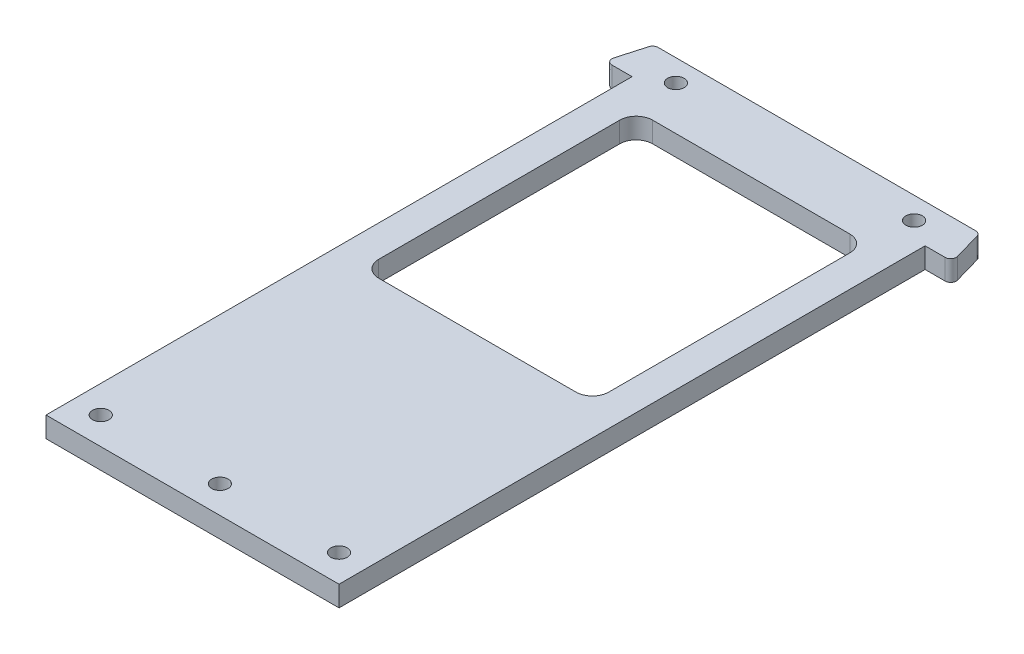
ISO-10303-21;
HEADER;
FILE_DESCRIPTION(('STEP AP214'),'2;1');
FILE_NAME('part.step','',(''),(''),'','','');
FILE_SCHEMA(('AUTOMOTIVE_DESIGN { 1 0 10303 214 1 1 1 1 }'));
ENDSEC;
DATA;
#1=APPLICATION_CONTEXT('core data for automotive mechanical design processes');
#2=APPLICATION_PROTOCOL_DEFINITION('international standard','automotive_design',2000,#1);
#3=PRODUCT_CONTEXT('',#1,'mechanical');
#4=PRODUCT('Part','Part','',(#3));
#5=PRODUCT_RELATED_PRODUCT_CATEGORY('part','',(#4));
#6=PRODUCT_DEFINITION_FORMATION('','',#4);
#7=PRODUCT_DEFINITION_CONTEXT('part definition',#1,'design');
#8=PRODUCT_DEFINITION('design','',#6,#7);
#9=PRODUCT_DEFINITION_SHAPE('','',#8);
#10=(LENGTH_UNIT() NAMED_UNIT(*) SI_UNIT(.MILLI.,.METRE.));
#11=(NAMED_UNIT(*) PLANE_ANGLE_UNIT() SI_UNIT($,.RADIAN.));
#12=(NAMED_UNIT(*) SI_UNIT($,.STERADIAN.) SOLID_ANGLE_UNIT());
#13=UNCERTAINTY_MEASURE_WITH_UNIT(LENGTH_MEASURE(1.E-05),#10,'distance_accuracy_value','');
#14=(GEOMETRIC_REPRESENTATION_CONTEXT(3) GLOBAL_UNCERTAINTY_ASSIGNED_CONTEXT((#13)) GLOBAL_UNIT_ASSIGNED_CONTEXT((#10,
#11,#12)) REPRESENTATION_CONTEXT('',''));
#15=CARTESIAN_POINT('',(0.,0.,0.));
#16=DIRECTION('',(0.,0.,1.));
#17=DIRECTION('',(1.,0.,0.));
#18=AXIS2_PLACEMENT_3D('',#15,#16,#17);
#19=CARTESIAN_POINT('',(0.,3.75,0.));
#20=DIRECTION('',(1.,0.,0.));
#21=DIRECTION('',(0.,0.,-1.));
#22=AXIS2_PLACEMENT_3D('',#19,#20,#21);
#23=PLANE('',#22);
#24=DIRECTION('',(0.,1.,0.));
#25=VECTOR('',#24,1.);
#26=CARTESIAN_POINT('',(0.,-8.60232526704263,-107.));
#27=LINE('',#26,#25);
#28=CARTESIAN_POINT('',(0.,0.,-107.));
#29=VERTEX_POINT('',#28);
#30=CARTESIAN_POINT('',(0.,3.75,-107.));
#31=VERTEX_POINT('',#30);
#32=EDGE_CURVE('E320',#29,#31,#27,.T.);
#33=ORIENTED_EDGE('',*,*,#32,.F.);
#34=DIRECTION('',(0.,0.,1.));
#35=VECTOR('',#34,1.);
#36=CARTESIAN_POINT('',(0.,0.,0.));
#37=LINE('',#36,#35);
#38=CARTESIAN_POINT('',(0.,0.,0.));
#39=VERTEX_POINT('',#38);
#40=EDGE_CURVE('E202',#29,#39,#37,.T.);
#41=ORIENTED_EDGE('',*,*,#40,.T.);
#42=DIRECTION('',(0.,-1.,0.));
#43=VECTOR('',#42,1.);
#44=CARTESIAN_POINT('',(0.,3.75,0.));
#45=LINE('',#44,#43);
#46=CARTESIAN_POINT('',(0.,3.75,0.));
#47=VERTEX_POINT('',#46);
#48=EDGE_CURVE('E216',#47,#39,#45,.T.);
#49=ORIENTED_EDGE('',*,*,#48,.F.);
#50=DIRECTION('',(0.,0.,1.));
#51=VECTOR('',#50,1.);
#52=CARTESIAN_POINT('',(0.,3.75,0.));
#53=LINE('',#52,#51);
#54=EDGE_CURVE('E200',#31,#47,#53,.T.);
#55=ORIENTED_EDGE('',*,*,#54,.F.);
#56=EDGE_LOOP('',(#33,#41,#49,#55));
#57=FACE_BOUND('',#56,.T.);
#58=ADVANCED_FACE('F32',(#57),#23,.F.);
#59=CARTESIAN_POINT('',(0.,3.75,0.));
#60=DIRECTION('',(0.,-1.,0.));
#61=DIRECTION('',(0.,0.,-1.));
#62=AXIS2_PLACEMENT_3D('',#59,#60,#61);
#63=PLANE('',#62);
#64=CARTESIAN_POINT('',(5.,3.75,-110.));
#65=DIRECTION('',(0.,1.,0.));
#66=DIRECTION('',(0.,0.,1.));
#67=AXIS2_PLACEMENT_3D('',#64,#65,#66);
#68=CIRCLE('',#67,1.5);
#69=CARTESIAN_POINT('',(5.,3.75,-108.5));
#70=VERTEX_POINT('',#69);
#71=EDGE_CURVE('E308',#70,#70,#68,.T.);
#72=ORIENTED_EDGE('',*,*,#71,.F.);
#73=EDGE_LOOP('',(#72));
#74=FACE_BOUND('',#73,.T.);
#75=CARTESIAN_POINT('',(48.5,3.75,-5.));
#76=DIRECTION('',(0.,1.,0.));
#77=DIRECTION('',(0.,0.,1.));
#78=AXIS2_PLACEMENT_3D('',#75,#76,#77);
#79=CIRCLE('',#78,1.5);
#80=CARTESIAN_POINT('',(48.5,3.75,-3.5));
#81=VERTEX_POINT('',#80);
#82=EDGE_CURVE('E296',#81,#81,#79,.T.);
#83=ORIENTED_EDGE('',*,*,#82,.F.);
#84=EDGE_LOOP('',(#83));
#85=FACE_BOUND('',#84,.T.);
#86=DIRECTION('',(0.,0.,1.));
#87=VECTOR('',#86,1.);
#88=CARTESIAN_POINT('',(5.75,3.75,-102.));
#89=LINE('',#88,#87);
#90=CARTESIAN_POINT('',(5.75,3.75,-99.));
#91=VERTEX_POINT('',#90);
#92=CARTESIAN_POINT('',(5.75000000000001,3.75,-55.));
#93=VERTEX_POINT('',#92);
#94=EDGE_CURVE('E272',#91,#93,#89,.T.);
#95=ORIENTED_EDGE('',*,*,#94,.F.);
#96=CARTESIAN_POINT('',(8.75,3.75,-99.));
#97=DIRECTION('',(0.,-1.,0.));
#98=DIRECTION('',(0.,0.,-1.));
#99=AXIS2_PLACEMENT_3D('',#96,#97,#98);
#100=CIRCLE('',#99,3.);
#101=CARTESIAN_POINT('',(8.75,3.75,-102.));
#102=VERTEX_POINT('',#101);
#103=EDGE_CURVE('E254',#91,#102,#100,.T.);
#104=ORIENTED_EDGE('',*,*,#103,.T.);
#105=DIRECTION('',(-1.,0.,0.));
#106=VECTOR('',#105,1.);
#107=CARTESIAN_POINT('',(5.75,3.75,-102.));
#108=LINE('',#107,#106);
#109=CARTESIAN_POINT('',(44.75,3.75,-102.));
#110=VERTEX_POINT('',#109);
#111=EDGE_CURVE('E258',#110,#102,#108,.T.);
#112=ORIENTED_EDGE('',*,*,#111,.F.);
#113=CARTESIAN_POINT('',(44.75,3.75,-99.));
#114=DIRECTION('',(0.,-1.,0.));
#115=DIRECTION('',(0.,0.,-1.));
#116=AXIS2_PLACEMENT_3D('',#113,#114,#115);
#117=CIRCLE('',#116,3.);
#118=CARTESIAN_POINT('',(47.75,3.75,-99.));
#119=VERTEX_POINT('',#118);
#120=EDGE_CURVE('E250',#110,#119,#117,.T.);
#121=ORIENTED_EDGE('',*,*,#120,.T.);
#122=DIRECTION('',(0.,0.,-1.));
#123=VECTOR('',#122,1.);
#124=CARTESIAN_POINT('',(47.75,3.75,-102.));
#125=LINE('',#124,#123);
#126=CARTESIAN_POINT('',(47.75,3.75,-55.));
#127=VERTEX_POINT('',#126);
#128=EDGE_CURVE('E285',#127,#119,#125,.T.);
#129=ORIENTED_EDGE('',*,*,#128,.F.);
#130=CARTESIAN_POINT('',(44.75,3.75,-55.));
#131=DIRECTION('',(0.,-1.,0.));
#132=DIRECTION('',(0.,0.,-1.));
#133=AXIS2_PLACEMENT_3D('',#130,#131,#132);
#134=CIRCLE('',#133,3.);
#135=CARTESIAN_POINT('',(44.75,3.75,-52.));
#136=VERTEX_POINT('',#135);
#137=EDGE_CURVE('E242',#127,#136,#134,.T.);
#138=ORIENTED_EDGE('',*,*,#137,.T.);
#139=DIRECTION('',(1.,0.,0.));
#140=VECTOR('',#139,1.);
#141=CARTESIAN_POINT('',(5.75000000000001,3.75,-52.));
#142=LINE('',#141,#140);
#143=CARTESIAN_POINT('',(8.75,3.75,-52.));
#144=VERTEX_POINT('',#143);
#145=EDGE_CURVE('E288',#144,#136,#142,.T.);
#146=ORIENTED_EDGE('',*,*,#145,.F.);
#147=CARTESIAN_POINT('',(8.75000000000001,3.75,-55.));
#148=DIRECTION('',(0.,-1.,0.));
#149=DIRECTION('',(0.,0.,-1.));
#150=AXIS2_PLACEMENT_3D('',#147,#148,#149);
#151=CIRCLE('',#150,3.);
#152=EDGE_CURVE('E246',#144,#93,#151,.T.);
#153=ORIENTED_EDGE('',*,*,#152,.T.);
#154=EDGE_LOOP('',(#95,#104,#112,#121,#129,#138,#146,#153));
#155=FACE_BOUND('',#154,.T.);
#156=DIRECTION('',(-0.274721127897377,0.,-0.961523947640823));
#157=VECTOR('',#156,1.);
#158=CARTESIAN_POINT('',(56.5,3.75,-114.));
#159=LINE('',#158,#157);
#160=CARTESIAN_POINT('',(58.1357939634579,3.75,-108.274721127897));
#161=VERTEX_POINT('',#160);
#162=CARTESIAN_POINT('',(56.7072225348865,3.75,-113.274721127897));
#163=VERTEX_POINT('',#162);
#164=EDGE_CURVE('E180',#161,#163,#159,.T.);
#165=ORIENTED_EDGE('',*,*,#164,.T.);
#166=CARTESIAN_POINT('',(55.7456985872456,3.75,-113.));
#167=DIRECTION('',(0.,-1.,0.));
#168=DIRECTION('',(0.,0.,-1.));
#169=AXIS2_PLACEMENT_3D('',#166,#167,#168);
#170=CIRCLE('',#169,1.);
#171=CARTESIAN_POINT('',(55.7456985872456,3.75,-114.));
#172=VERTEX_POINT('',#171);
#173=EDGE_CURVE('E342',#163,#172,#170,.F.);
#174=ORIENTED_EDGE('',*,*,#173,.T.);
#175=DIRECTION('',(-1.,0.,0.));
#176=VECTOR('',#175,1.);
#177=CARTESIAN_POINT('',(0.,3.75,-114.));
#178=LINE('',#177,#176);
#179=CARTESIAN_POINT('',(-2.24569858724564,3.75,-114.));
#180=VERTEX_POINT('',#179);
#181=EDGE_CURVE('E217',#172,#180,#178,.T.);
#182=ORIENTED_EDGE('',*,*,#181,.T.);
#183=CARTESIAN_POINT('',(-2.24569858724564,3.75,-113.));
#184=DIRECTION('',(0.,-1.,0.));
#185=DIRECTION('',(0.,0.,-1.));
#186=AXIS2_PLACEMENT_3D('',#183,#184,#185);
#187=CIRCLE('',#186,1.);
#188=CARTESIAN_POINT('',(-3.20722253488646,3.75,-113.274721127897));
#189=VERTEX_POINT('',#188);
#190=EDGE_CURVE('E336',#180,#189,#187,.F.);
#191=ORIENTED_EDGE('',*,*,#190,.T.);
#192=DIRECTION('',(-0.274721127897378,0.,0.961523947640823));
#193=VECTOR('',#192,1.);
#194=CARTESIAN_POINT('',(-3.,3.75,-114.));
#195=LINE('',#194,#193);
#196=CARTESIAN_POINT('',(-4.63579396345789,3.75,-108.274721127897));
#197=VERTEX_POINT('',#196);
#198=EDGE_CURVE('E190',#189,#197,#195,.T.);
#199=ORIENTED_EDGE('',*,*,#198,.T.);
#200=CARTESIAN_POINT('',(-3.67427001581707,3.75,-108.));
#201=DIRECTION('',(0.,-1.,0.));
#202=DIRECTION('',(0.,0.,-1.));
#203=AXIS2_PLACEMENT_3D('',#200,#201,#202);
#204=CIRCLE('',#203,1.);
#205=CARTESIAN_POINT('',(-3.67427001581707,3.75,-107.));
#206=VERTEX_POINT('',#205);
#207=EDGE_CURVE('E338',#197,#206,#204,.F.);
#208=ORIENTED_EDGE('',*,*,#207,.T.);
#209=DIRECTION('',(1.,0.,0.));
#210=VECTOR('',#209,1.);
#211=CARTESIAN_POINT('',(-5.,3.75,-107.));
#212=LINE('',#211,#210);
#213=EDGE_CURVE('E331',#206,#31,#212,.T.);
#214=ORIENTED_EDGE('',*,*,#213,.T.);
#215=ORIENTED_EDGE('',*,*,#54,.T.);
#216=DIRECTION('',(1.,0.,0.));
#217=VECTOR('',#216,1.);
#218=CARTESIAN_POINT('',(0.,3.75,0.));
#219=LINE('',#218,#217);
#220=CARTESIAN_POINT('',(53.5,3.75,0.));
#221=VERTEX_POINT('',#220);
#222=EDGE_CURVE('E266',#47,#221,#219,.T.);
#223=ORIENTED_EDGE('',*,*,#222,.T.);
#224=DIRECTION('',(0.,0.,-1.));
#225=VECTOR('',#224,1.);
#226=CARTESIAN_POINT('',(53.5,3.75,0.));
#227=LINE('',#226,#225);
#228=CARTESIAN_POINT('',(53.5,3.75,-107.));
#229=VERTEX_POINT('',#228);
#230=EDGE_CURVE('E209',#221,#229,#227,.T.);
#231=ORIENTED_EDGE('',*,*,#230,.T.);
#232=DIRECTION('',(1.,0.,0.));
#233=VECTOR('',#232,1.);
#234=CARTESIAN_POINT('',(58.5,3.75,-107.));
#235=LINE('',#234,#233);
#236=CARTESIAN_POINT('',(57.1742700158171,3.75,-107.));
#237=VERTEX_POINT('',#236);
#238=EDGE_CURVE('E186',#229,#237,#235,.T.);
#239=ORIENTED_EDGE('',*,*,#238,.T.);
#240=CARTESIAN_POINT('',(57.1742700158171,3.75,-108.));
#241=DIRECTION('',(0.,-1.,0.));
#242=DIRECTION('',(0.,0.,-1.));
#243=AXIS2_PLACEMENT_3D('',#240,#241,#242);
#244=CIRCLE('',#243,1.);
#245=EDGE_CURVE('E340',#237,#161,#244,.F.);
#246=ORIENTED_EDGE('',*,*,#245,.T.);
#247=EDGE_LOOP('',(#165,#174,#182,#191,#199,#208,#214,#215,#223,#231,#239,#246));
#248=FACE_BOUND('',#247,.T.);
#249=CARTESIAN_POINT('',(5.,3.75,-5.));
#250=DIRECTION('',(0.,1.,0.));
#251=DIRECTION('',(0.,0.,1.));
#252=AXIS2_PLACEMENT_3D('',#249,#250,#251);
#253=CIRCLE('',#252,1.5);
#254=CARTESIAN_POINT('',(5.,3.75,-3.5));
#255=VERTEX_POINT('',#254);
#256=EDGE_CURVE('E282',#255,#255,#253,.T.);
#257=ORIENTED_EDGE('',*,*,#256,.F.);
#258=EDGE_LOOP('',(#257));
#259=FACE_BOUND('',#258,.T.);
#260=CARTESIAN_POINT('',(26.75,3.75,-5.));
#261=DIRECTION('',(0.,1.,0.));
#262=DIRECTION('',(0.,0.,1.));
#263=AXIS2_PLACEMENT_3D('',#260,#261,#262);
#264=CIRCLE('',#263,1.5);
#265=CARTESIAN_POINT('',(26.75,3.75,-3.5));
#266=VERTEX_POINT('',#265);
#267=EDGE_CURVE('E302',#266,#266,#264,.T.);
#268=ORIENTED_EDGE('',*,*,#267,.F.);
#269=EDGE_LOOP('',(#268));
#270=FACE_BOUND('',#269,.T.);
#271=CARTESIAN_POINT('',(48.5,3.75,-110.));
#272=DIRECTION('',(0.,1.,0.));
#273=DIRECTION('',(0.,0.,1.));
#274=AXIS2_PLACEMENT_3D('',#271,#272,#273);
#275=CIRCLE('',#274,1.5);
#276=CARTESIAN_POINT('',(48.5,3.75,-108.5));
#277=VERTEX_POINT('',#276);
#278=EDGE_CURVE('E314',#277,#277,#275,.T.);
#279=ORIENTED_EDGE('',*,*,#278,.F.);
#280=EDGE_LOOP('',(#279));
#281=FACE_BOUND('',#280,.T.);
#282=ADVANCED_FACE('F369',(#74,#85,#155,#248,#259,#270,#281),#63,.F.);
#283=CARTESIAN_POINT('',(0.,0.,0.));
#284=DIRECTION('',(0.,-1.,0.));
#285=DIRECTION('',(0.,0.,-1.));
#286=AXIS2_PLACEMENT_3D('',#283,#284,#285);
#287=PLANE('',#286);
#288=CARTESIAN_POINT('',(5.,0.,-110.));
#289=DIRECTION('',(0.,1.,0.));
#290=DIRECTION('',(0.,0.,1.));
#291=AXIS2_PLACEMENT_3D('',#288,#289,#290);
#292=CIRCLE('',#291,1.5);
#293=CARTESIAN_POINT('',(5.,0.,-108.5));
#294=VERTEX_POINT('',#293);
#295=EDGE_CURVE('E311',#294,#294,#292,.T.);
#296=ORIENTED_EDGE('',*,*,#295,.T.);
#297=EDGE_LOOP('',(#296));
#298=FACE_BOUND('',#297,.T.);
#299=CARTESIAN_POINT('',(48.5,0.,-5.));
#300=DIRECTION('',(0.,1.,0.));
#301=DIRECTION('',(0.,0.,1.));
#302=AXIS2_PLACEMENT_3D('',#299,#300,#301);
#303=CIRCLE('',#302,1.5);
#304=CARTESIAN_POINT('',(48.5,0.,-3.5));
#305=VERTEX_POINT('',#304);
#306=EDGE_CURVE('E299',#305,#305,#303,.T.);
#307=ORIENTED_EDGE('',*,*,#306,.T.);
#308=EDGE_LOOP('',(#307));
#309=FACE_BOUND('',#308,.T.);
#310=DIRECTION('',(0.,0.,-1.));
#311=VECTOR('',#310,1.);
#312=CARTESIAN_POINT('',(47.75,0.,-102.));
#313=LINE('',#312,#311);
#314=CARTESIAN_POINT('',(47.75,0.,-55.));
#315=VERTEX_POINT('',#314);
#316=CARTESIAN_POINT('',(47.75,0.,-99.));
#317=VERTEX_POINT('',#316);
#318=EDGE_CURVE('E273',#315,#317,#313,.T.);
#319=ORIENTED_EDGE('',*,*,#318,.T.);
#320=CARTESIAN_POINT('',(44.75,0.,-99.));
#321=DIRECTION('',(0.,-1.,0.));
#322=DIRECTION('',(0.,0.,-1.));
#323=AXIS2_PLACEMENT_3D('',#320,#321,#322);
#324=CIRCLE('',#323,3.);
#325=CARTESIAN_POINT('',(44.75,0.,-102.));
#326=VERTEX_POINT('',#325);
#327=EDGE_CURVE('E248',#317,#326,#324,.F.);
#328=ORIENTED_EDGE('',*,*,#327,.T.);
#329=DIRECTION('',(-1.,0.,0.));
#330=VECTOR('',#329,1.);
#331=CARTESIAN_POINT('',(5.75,0.,-102.));
#332=LINE('',#331,#330);
#333=CARTESIAN_POINT('',(8.75,0.,-102.));
#334=VERTEX_POINT('',#333);
#335=EDGE_CURVE('E269',#326,#334,#332,.T.);
#336=ORIENTED_EDGE('',*,*,#335,.T.);
#337=CARTESIAN_POINT('',(8.75,0.,-99.));
#338=DIRECTION('',(0.,-1.,0.));
#339=DIRECTION('',(0.,0.,-1.));
#340=AXIS2_PLACEMENT_3D('',#337,#338,#339);
#341=CIRCLE('',#340,3.);
#342=CARTESIAN_POINT('',(5.75,0.,-99.));
#343=VERTEX_POINT('',#342);
#344=EDGE_CURVE('E252',#334,#343,#341,.F.);
#345=ORIENTED_EDGE('',*,*,#344,.T.);
#346=DIRECTION('',(0.,0.,1.));
#347=VECTOR('',#346,1.);
#348=CARTESIAN_POINT('',(5.75,0.,-102.));
#349=LINE('',#348,#347);
#350=CARTESIAN_POINT('',(5.75000000000001,0.,-55.));
#351=VERTEX_POINT('',#350);
#352=EDGE_CURVE('E279',#343,#351,#349,.T.);
#353=ORIENTED_EDGE('',*,*,#352,.T.);
#354=CARTESIAN_POINT('',(8.75000000000001,0.,-55.));
#355=DIRECTION('',(0.,-1.,0.));
#356=DIRECTION('',(0.,0.,-1.));
#357=AXIS2_PLACEMENT_3D('',#354,#355,#356);
#358=CIRCLE('',#357,3.);
#359=CARTESIAN_POINT('',(8.75,0.,-52.));
#360=VERTEX_POINT('',#359);
#361=EDGE_CURVE('E244',#351,#360,#358,.F.);
#362=ORIENTED_EDGE('',*,*,#361,.T.);
#363=DIRECTION('',(1.,0.,0.));
#364=VECTOR('',#363,1.);
#365=CARTESIAN_POINT('',(5.75000000000001,0.,-52.));
#366=LINE('',#365,#364);
#367=CARTESIAN_POINT('',(44.75,0.,-52.));
#368=VERTEX_POINT('',#367);
#369=EDGE_CURVE('E276',#360,#368,#366,.T.);
#370=ORIENTED_EDGE('',*,*,#369,.T.);
#371=CARTESIAN_POINT('',(44.75,0.,-55.));
#372=DIRECTION('',(0.,-1.,0.));
#373=DIRECTION('',(0.,0.,-1.));
#374=AXIS2_PLACEMENT_3D('',#371,#372,#373);
#375=CIRCLE('',#374,3.);
#376=EDGE_CURVE('E240',#368,#315,#375,.F.);
#377=ORIENTED_EDGE('',*,*,#376,.T.);
#378=EDGE_LOOP('',(#319,#328,#336,#345,#353,#362,#370,#377));
#379=FACE_BOUND('',#378,.T.);
#380=DIRECTION('',(-1.,0.,0.));
#381=VECTOR('',#380,1.);
#382=CARTESIAN_POINT('',(0.,0.,-114.));
#383=LINE('',#382,#381);
#384=CARTESIAN_POINT('',(55.7456985872456,0.,-114.));
#385=VERTEX_POINT('',#384);
#386=CARTESIAN_POINT('',(-2.24569858724564,0.,-114.));
#387=VERTEX_POINT('',#386);
#388=EDGE_CURVE('E196',#385,#387,#383,.T.);
#389=ORIENTED_EDGE('',*,*,#388,.F.);
#390=CARTESIAN_POINT('',(55.7456985872456,0.,-113.));
#391=DIRECTION('',(0.,-1.,0.));
#392=DIRECTION('',(0.,0.,-1.));
#393=AXIS2_PLACEMENT_3D('',#390,#391,#392);
#394=CIRCLE('',#393,1.);
#395=CARTESIAN_POINT('',(56.7072225348865,0.,-113.274721127897));
#396=VERTEX_POINT('',#395);
#397=EDGE_CURVE('E354',#385,#396,#394,.T.);
#398=ORIENTED_EDGE('',*,*,#397,.T.);
#399=DIRECTION('',(-0.274721127897377,0.,-0.961523947640823));
#400=VECTOR('',#399,1.);
#401=CARTESIAN_POINT('',(56.5,0.,-114.));
#402=LINE('',#401,#400);
#403=CARTESIAN_POINT('',(58.1357939634579,0.,-108.274721127897));
#404=VERTEX_POINT('',#403);
#405=EDGE_CURVE('E179',#404,#396,#402,.T.);
#406=ORIENTED_EDGE('',*,*,#405,.F.);
#407=CARTESIAN_POINT('',(57.1742700158171,0.,-108.));
#408=DIRECTION('',(0.,-1.,0.));
#409=DIRECTION('',(0.,0.,-1.));
#410=AXIS2_PLACEMENT_3D('',#407,#408,#409);
#411=CIRCLE('',#410,1.);
#412=CARTESIAN_POINT('',(57.1742700158171,0.,-107.));
#413=VERTEX_POINT('',#412);
#414=EDGE_CURVE('E47',#404,#413,#411,.T.);
#415=ORIENTED_EDGE('',*,*,#414,.T.);
#416=DIRECTION('',(1.,0.,0.));
#417=VECTOR('',#416,1.);
#418=CARTESIAN_POINT('',(58.5,0.,-107.));
#419=LINE('',#418,#417);
#420=CARTESIAN_POINT('',(53.5,0.,-107.));
#421=VERTEX_POINT('',#420);
#422=EDGE_CURVE('E168',#421,#413,#419,.T.);
#423=ORIENTED_EDGE('',*,*,#422,.F.);
#424=DIRECTION('',(0.,0.,-1.));
#425=VECTOR('',#424,1.);
#426=CARTESIAN_POINT('',(53.5,0.,0.));
#427=LINE('',#426,#425);
#428=CARTESIAN_POINT('',(53.5,0.,0.));
#429=VERTEX_POINT('',#428);
#430=EDGE_CURVE('E175',#429,#421,#427,.T.);
#431=ORIENTED_EDGE('',*,*,#430,.F.);
#432=DIRECTION('',(1.,0.,0.));
#433=VECTOR('',#432,1.);
#434=CARTESIAN_POINT('',(0.,0.,0.));
#435=LINE('',#434,#433);
#436=EDGE_CURVE('E197',#39,#429,#435,.T.);
#437=ORIENTED_EDGE('',*,*,#436,.F.);
#438=ORIENTED_EDGE('',*,*,#40,.F.);
#439=DIRECTION('',(1.,0.,0.));
#440=VECTOR('',#439,1.);
#441=CARTESIAN_POINT('',(-5.,0.,-107.));
#442=LINE('',#441,#440);
#443=CARTESIAN_POINT('',(-3.67427001581707,0.,-107.));
#444=VERTEX_POINT('',#443);
#445=EDGE_CURVE('E328',#444,#29,#442,.T.);
#446=ORIENTED_EDGE('',*,*,#445,.F.);
#447=CARTESIAN_POINT('',(-3.67427001581707,0.,-108.));
#448=DIRECTION('',(0.,-1.,0.));
#449=DIRECTION('',(0.,0.,-1.));
#450=AXIS2_PLACEMENT_3D('',#447,#448,#449);
#451=CIRCLE('',#450,1.);
#452=CARTESIAN_POINT('',(-4.63579396345789,0.,-108.274721127897));
#453=VERTEX_POINT('',#452);
#454=EDGE_CURVE('E54',#444,#453,#451,.T.);
#455=ORIENTED_EDGE('',*,*,#454,.T.);
#456=DIRECTION('',(-0.274721127897378,0.,0.961523947640823));
#457=VECTOR('',#456,1.);
#458=CARTESIAN_POINT('',(-3.,0.,-114.));
#459=LINE('',#458,#457);
#460=CARTESIAN_POINT('',(-3.20722253488646,0.,-113.274721127897));
#461=VERTEX_POINT('',#460);
#462=EDGE_CURVE('E325',#461,#453,#459,.T.);
#463=ORIENTED_EDGE('',*,*,#462,.F.);
#464=CARTESIAN_POINT('',(-2.24569858724564,0.,-113.));
#465=DIRECTION('',(0.,-1.,0.));
#466=DIRECTION('',(0.,0.,-1.));
#467=AXIS2_PLACEMENT_3D('',#464,#465,#466);
#468=CIRCLE('',#467,1.);
#469=EDGE_CURVE('E349',#461,#387,#468,.T.);
#470=ORIENTED_EDGE('',*,*,#469,.T.);
#471=EDGE_LOOP('',(#389,#398,#406,#415,#423,#431,#437,#438,#446,#455,#463,#470));
#472=FACE_BOUND('',#471,.T.);
#473=CARTESIAN_POINT('',(5.,0.,-5.));
#474=DIRECTION('',(0.,1.,0.));
#475=DIRECTION('',(0.,0.,1.));
#476=AXIS2_PLACEMENT_3D('',#473,#474,#475);
#477=CIRCLE('',#476,1.5);
#478=CARTESIAN_POINT('',(5.,0.,-3.5));
#479=VERTEX_POINT('',#478);
#480=EDGE_CURVE('E293',#479,#479,#477,.T.);
#481=ORIENTED_EDGE('',*,*,#480,.T.);
#482=EDGE_LOOP('',(#481));
#483=FACE_BOUND('',#482,.T.);
#484=CARTESIAN_POINT('',(26.75,0.,-5.));
#485=DIRECTION('',(0.,1.,0.));
#486=DIRECTION('',(0.,0.,1.));
#487=AXIS2_PLACEMENT_3D('',#484,#485,#486);
#488=CIRCLE('',#487,1.5);
#489=CARTESIAN_POINT('',(26.75,0.,-3.5));
#490=VERTEX_POINT('',#489);
#491=EDGE_CURVE('E305',#490,#490,#488,.T.);
#492=ORIENTED_EDGE('',*,*,#491,.T.);
#493=EDGE_LOOP('',(#492));
#494=FACE_BOUND('',#493,.T.);
#495=CARTESIAN_POINT('',(48.5,0.,-110.));
#496=DIRECTION('',(0.,1.,0.));
#497=DIRECTION('',(0.,0.,1.));
#498=AXIS2_PLACEMENT_3D('',#495,#496,#497);
#499=CIRCLE('',#498,1.5);
#500=CARTESIAN_POINT('',(48.5,0.,-108.5));
#501=VERTEX_POINT('',#500);
#502=EDGE_CURVE('E317',#501,#501,#499,.T.);
#503=ORIENTED_EDGE('',*,*,#502,.T.);
#504=EDGE_LOOP('',(#503));
#505=FACE_BOUND('',#504,.T.);
#506=ADVANCED_FACE('F171',(#298,#309,#379,#472,#483,#494,#505),#287,.T.);
#507=CARTESIAN_POINT('',(0.,3.75,0.));
#508=DIRECTION('',(0.,0.,-1.));
#509=DIRECTION('',(-1.,0.,0.));
#510=AXIS2_PLACEMENT_3D('',#507,#508,#509);
#511=PLANE('',#510);
#512=ORIENTED_EDGE('',*,*,#436,.T.);
#513=DIRECTION('',(0.,-1.,0.));
#514=VECTOR('',#513,1.);
#515=CARTESIAN_POINT('',(53.5,3.75,0.));
#516=LINE('',#515,#514);
#517=EDGE_CURVE('E195',#221,#429,#516,.T.);
#518=ORIENTED_EDGE('',*,*,#517,.F.);
#519=ORIENTED_EDGE('',*,*,#222,.F.);
#520=ORIENTED_EDGE('',*,*,#48,.T.);
#521=EDGE_LOOP('',(#512,#518,#519,#520));
#522=FACE_BOUND('',#521,.T.);
#523=ADVANCED_FACE('F394',(#522),#511,.F.);
#524=CARTESIAN_POINT('',(53.5,3.75,0.));
#525=DIRECTION('',(-1.,0.,0.));
#526=DIRECTION('',(0.,0.,1.));
#527=AXIS2_PLACEMENT_3D('',#524,#525,#526);
#528=PLANE('',#527);
#529=ORIENTED_EDGE('',*,*,#430,.T.);
#530=DIRECTION('',(0.,1.,0.));
#531=VECTOR('',#530,1.);
#532=CARTESIAN_POINT('',(53.5,-8.60232526704263,-107.));
#533=LINE('',#532,#531);
#534=EDGE_CURVE('E183',#421,#229,#533,.T.);
#535=ORIENTED_EDGE('',*,*,#534,.T.);
#536=ORIENTED_EDGE('',*,*,#230,.F.);
#537=ORIENTED_EDGE('',*,*,#517,.T.);
#538=EDGE_LOOP('',(#529,#535,#536,#537));
#539=FACE_BOUND('',#538,.T.);
#540=ADVANCED_FACE('F193',(#539),#528,.F.);
#541=CARTESIAN_POINT('',(0.,3.75,-114.));
#542=DIRECTION('',(0.,0.,1.));
#543=DIRECTION('',(1.,0.,0.));
#544=AXIS2_PLACEMENT_3D('',#541,#542,#543);
#545=PLANE('',#544);
#546=ORIENTED_EDGE('',*,*,#181,.F.);
#547=DIRECTION('',(0.,1.,0.));
#548=VECTOR('',#547,1.);
#549=CARTESIAN_POINT('',(55.7456985872456,0.,-114.));
#550=LINE('',#549,#548);
#551=EDGE_CURVE('E347',#172,#385,#550,.F.);
#552=ORIENTED_EDGE('',*,*,#551,.T.);
#553=ORIENTED_EDGE('',*,*,#388,.T.);
#554=DIRECTION('',(0.,1.,0.));
#555=VECTOR('',#554,1.);
#556=CARTESIAN_POINT('',(-2.24569858724564,3.75,-114.));
#557=LINE('',#556,#555);
#558=EDGE_CURVE('E344',#387,#180,#557,.T.);
#559=ORIENTED_EDGE('',*,*,#558,.T.);
#560=EDGE_LOOP('',(#546,#552,#553,#559));
#561=FACE_BOUND('',#560,.T.);
#562=ADVANCED_FACE('F448',(#561),#545,.F.);
#563=CARTESIAN_POINT('',(5.75,3.75,-102.));
#564=DIRECTION('',(1.,0.,0.));
#565=DIRECTION('',(0.,0.,-1.));
#566=AXIS2_PLACEMENT_3D('',#563,#564,#565);
#567=PLANE('',#566);
#568=ORIENTED_EDGE('',*,*,#94,.T.);
#569=DIRECTION('',(0.,-1.,0.));
#570=VECTOR('',#569,1.);
#571=CARTESIAN_POINT('',(5.75000000000001,0.,-55.));
#572=LINE('',#571,#570);
#573=EDGE_CURVE('E232',#93,#351,#572,.T.);
#574=ORIENTED_EDGE('',*,*,#573,.T.);
#575=ORIENTED_EDGE('',*,*,#352,.F.);
#576=DIRECTION('',(0.,-1.,0.));
#577=VECTOR('',#576,1.);
#578=CARTESIAN_POINT('',(5.75,3.75,-99.));
#579=LINE('',#578,#577);
#580=EDGE_CURVE('E230',#343,#91,#579,.F.);
#581=ORIENTED_EDGE('',*,*,#580,.T.);
#582=EDGE_LOOP('',(#568,#574,#575,#581));
#583=FACE_BOUND('',#582,.T.);
#584=ADVANCED_FACE('F450',(#583),#567,.T.);
#585=CARTESIAN_POINT('',(5.75000000000001,3.75,-52.));
#586=DIRECTION('',(0.,0.,-1.));
#587=DIRECTION('',(-1.,0.,0.));
#588=AXIS2_PLACEMENT_3D('',#585,#586,#587);
#589=PLANE('',#588);
#590=ORIENTED_EDGE('',*,*,#145,.T.);
#591=DIRECTION('',(0.,-1.,0.));
#592=VECTOR('',#591,1.);
#593=CARTESIAN_POINT('',(44.75,0.,-52.));
#594=LINE('',#593,#592);
#595=EDGE_CURVE('E222',#136,#368,#594,.T.);
#596=ORIENTED_EDGE('',*,*,#595,.T.);
#597=ORIENTED_EDGE('',*,*,#369,.F.);
#598=DIRECTION('',(0.,-1.,0.));
#599=VECTOR('',#598,1.);
#600=CARTESIAN_POINT('',(8.75000000000001,3.75,-52.));
#601=LINE('',#600,#599);
#602=EDGE_CURVE('E220',#360,#144,#601,.F.);
#603=ORIENTED_EDGE('',*,*,#602,.T.);
#604=EDGE_LOOP('',(#590,#596,#597,#603));
#605=FACE_BOUND('',#604,.T.);
#606=ADVANCED_FACE('F456',(#605),#589,.T.);
#607=CARTESIAN_POINT('',(47.75,3.75,-102.));
#608=DIRECTION('',(-1.,0.,0.));
#609=DIRECTION('',(0.,0.,1.));
#610=AXIS2_PLACEMENT_3D('',#607,#608,#609);
#611=PLANE('',#610);
#612=ORIENTED_EDGE('',*,*,#318,.F.);
#613=DIRECTION('',(0.,-1.,0.));
#614=VECTOR('',#613,1.);
#615=CARTESIAN_POINT('',(47.75,3.75,-55.));
#616=LINE('',#615,#614);
#617=EDGE_CURVE('E228',#315,#127,#616,.F.);
#618=ORIENTED_EDGE('',*,*,#617,.T.);
#619=ORIENTED_EDGE('',*,*,#128,.T.);
#620=DIRECTION('',(0.,-1.,0.));
#621=VECTOR('',#620,1.);
#622=CARTESIAN_POINT('',(47.75,0.,-99.));
#623=LINE('',#622,#621);
#624=EDGE_CURVE('E225',#119,#317,#623,.T.);
#625=ORIENTED_EDGE('',*,*,#624,.T.);
#626=EDGE_LOOP('',(#612,#618,#619,#625));
#627=FACE_BOUND('',#626,.T.);
#628=ADVANCED_FACE('F465',(#627),#611,.T.);
#629=CARTESIAN_POINT('',(5.75,3.75,-102.));
#630=DIRECTION('',(0.,0.,1.));
#631=DIRECTION('',(1.,0.,0.));
#632=AXIS2_PLACEMENT_3D('',#629,#630,#631);
#633=PLANE('',#632);
#634=ORIENTED_EDGE('',*,*,#335,.F.);
#635=DIRECTION('',(0.,-1.,0.));
#636=VECTOR('',#635,1.);
#637=CARTESIAN_POINT('',(44.75,3.75,-102.));
#638=LINE('',#637,#636);
#639=EDGE_CURVE('E238',#326,#110,#638,.F.);
#640=ORIENTED_EDGE('',*,*,#639,.T.);
#641=ORIENTED_EDGE('',*,*,#111,.T.);
#642=DIRECTION('',(0.,-1.,0.));
#643=VECTOR('',#642,1.);
#644=CARTESIAN_POINT('',(8.75,0.,-102.));
#645=LINE('',#644,#643);
#646=EDGE_CURVE('E235',#102,#334,#645,.T.);
#647=ORIENTED_EDGE('',*,*,#646,.T.);
#648=EDGE_LOOP('',(#634,#640,#641,#647));
#649=FACE_BOUND('',#648,.T.);
#650=ADVANCED_FACE('F469',(#649),#633,.T.);
#651=CARTESIAN_POINT('',(5.,3.75,-5.));
#652=DIRECTION('',(0.,-1.,0.));
#653=DIRECTION('',(0.,0.,-1.));
#654=AXIS2_PLACEMENT_3D('',#651,#652,#653);
#655=CYLINDRICAL_SURFACE('',#654,1.5);
#656=ORIENTED_EDGE('',*,*,#256,.T.);
#657=EDGE_LOOP('',(#656));
#658=FACE_BOUND('',#657,.T.);
#659=ORIENTED_EDGE('',*,*,#480,.F.);
#660=EDGE_LOOP('',(#659));
#661=FACE_BOUND('',#660,.T.);
#662=ADVANCED_FACE('F473',(#658,#661),#655,.F.);
#663=CARTESIAN_POINT('',(48.5,3.75,-5.));
#664=DIRECTION('',(0.,-1.,0.));
#665=DIRECTION('',(0.,0.,-1.));
#666=AXIS2_PLACEMENT_3D('',#663,#664,#665);
#667=CYLINDRICAL_SURFACE('',#666,1.5);
#668=ORIENTED_EDGE('',*,*,#82,.T.);
#669=EDGE_LOOP('',(#668));
#670=FACE_BOUND('',#669,.T.);
#671=ORIENTED_EDGE('',*,*,#306,.F.);
#672=EDGE_LOOP('',(#671));
#673=FACE_BOUND('',#672,.T.);
#674=ADVANCED_FACE('F477',(#670,#673),#667,.F.);
#675=CARTESIAN_POINT('',(26.75,3.75,-5.));
#676=DIRECTION('',(0.,-1.,0.));
#677=DIRECTION('',(0.,0.,-1.));
#678=AXIS2_PLACEMENT_3D('',#675,#676,#677);
#679=CYLINDRICAL_SURFACE('',#678,1.5);
#680=ORIENTED_EDGE('',*,*,#267,.T.);
#681=EDGE_LOOP('',(#680));
#682=FACE_BOUND('',#681,.T.);
#683=ORIENTED_EDGE('',*,*,#491,.F.);
#684=EDGE_LOOP('',(#683));
#685=FACE_BOUND('',#684,.T.);
#686=ADVANCED_FACE('F481',(#682,#685),#679,.F.);
#687=CARTESIAN_POINT('',(5.,3.75,-110.));
#688=DIRECTION('',(0.,-1.,0.));
#689=DIRECTION('',(0.,0.,-1.));
#690=AXIS2_PLACEMENT_3D('',#687,#688,#689);
#691=CYLINDRICAL_SURFACE('',#690,1.5);
#692=ORIENTED_EDGE('',*,*,#71,.T.);
#693=EDGE_LOOP('',(#692));
#694=FACE_BOUND('',#693,.T.);
#695=ORIENTED_EDGE('',*,*,#295,.F.);
#696=EDGE_LOOP('',(#695));
#697=FACE_BOUND('',#696,.T.);
#698=ADVANCED_FACE('F485',(#694,#697),#691,.F.);
#699=CARTESIAN_POINT('',(48.5,3.75,-110.));
#700=DIRECTION('',(0.,-1.,0.));
#701=DIRECTION('',(0.,0.,-1.));
#702=AXIS2_PLACEMENT_3D('',#699,#700,#701);
#703=CYLINDRICAL_SURFACE('',#702,1.5);
#704=ORIENTED_EDGE('',*,*,#278,.T.);
#705=EDGE_LOOP('',(#704));
#706=FACE_BOUND('',#705,.T.);
#707=ORIENTED_EDGE('',*,*,#502,.F.);
#708=EDGE_LOOP('',(#707));
#709=FACE_BOUND('',#708,.T.);
#710=ADVANCED_FACE('F426',(#706,#709),#703,.F.);
#711=CARTESIAN_POINT('',(44.75,3.75,-55.));
#712=DIRECTION('',(0.,1.,0.));
#713=DIRECTION('',(0.,0.,1.));
#714=AXIS2_PLACEMENT_3D('',#711,#712,#713);
#715=CYLINDRICAL_SURFACE('',#714,3.);
#716=ORIENTED_EDGE('',*,*,#137,.F.);
#717=ORIENTED_EDGE('',*,*,#617,.F.);
#718=ORIENTED_EDGE('',*,*,#376,.F.);
#719=ORIENTED_EDGE('',*,*,#595,.F.);
#720=EDGE_LOOP('',(#716,#717,#718,#719));
#721=FACE_BOUND('',#720,.T.);
#722=ADVANCED_FACE('F422',(#721),#715,.F.);
#723=CARTESIAN_POINT('',(8.75000000000001,3.75,-55.));
#724=DIRECTION('',(0.,1.,0.));
#725=DIRECTION('',(0.,0.,1.));
#726=AXIS2_PLACEMENT_3D('',#723,#724,#725);
#727=CYLINDRICAL_SURFACE('',#726,3.);
#728=ORIENTED_EDGE('',*,*,#152,.F.);
#729=ORIENTED_EDGE('',*,*,#602,.F.);
#730=ORIENTED_EDGE('',*,*,#361,.F.);
#731=ORIENTED_EDGE('',*,*,#573,.F.);
#732=EDGE_LOOP('',(#728,#729,#730,#731));
#733=FACE_BOUND('',#732,.T.);
#734=ADVANCED_FACE('F425',(#733),#727,.F.);
#735=CARTESIAN_POINT('',(44.75,3.75,-99.));
#736=DIRECTION('',(0.,1.,0.));
#737=DIRECTION('',(0.,0.,1.));
#738=AXIS2_PLACEMENT_3D('',#735,#736,#737);
#739=CYLINDRICAL_SURFACE('',#738,3.);
#740=ORIENTED_EDGE('',*,*,#120,.F.);
#741=ORIENTED_EDGE('',*,*,#639,.F.);
#742=ORIENTED_EDGE('',*,*,#327,.F.);
#743=ORIENTED_EDGE('',*,*,#624,.F.);
#744=EDGE_LOOP('',(#740,#741,#742,#743));
#745=FACE_BOUND('',#744,.T.);
#746=ADVANCED_FACE('F430',(#745),#739,.F.);
#747=CARTESIAN_POINT('',(8.75,3.75,-99.));
#748=DIRECTION('',(0.,1.,0.));
#749=DIRECTION('',(0.,0.,1.));
#750=AXIS2_PLACEMENT_3D('',#747,#748,#749);
#751=CYLINDRICAL_SURFACE('',#750,3.);
#752=ORIENTED_EDGE('',*,*,#103,.F.);
#753=ORIENTED_EDGE('',*,*,#580,.F.);
#754=ORIENTED_EDGE('',*,*,#344,.F.);
#755=ORIENTED_EDGE('',*,*,#646,.F.);
#756=EDGE_LOOP('',(#752,#753,#754,#755));
#757=FACE_BOUND('',#756,.T.);
#758=ADVANCED_FACE('F434',(#757),#751,.F.);
#759=CARTESIAN_POINT('',(-3.,-8.60232526704263,-114.));
#760=DIRECTION('',(-0.961523947640823,0.,-0.274721127897378));
#761=DIRECTION('',(-0.274721127897378,0.,0.961523947640823));
#762=AXIS2_PLACEMENT_3D('',#759,#760,#761);
#763=PLANE('',#762);
#764=ORIENTED_EDGE('',*,*,#462,.T.);
#765=DIRECTION('',(0.,1.,0.));
#766=VECTOR('',#765,1.);
#767=CARTESIAN_POINT('',(-4.63579396345789,-8.60232526704263,-108.274721127897));
#768=LINE('',#767,#766);
#769=EDGE_CURVE('E40',#453,#197,#768,.T.);
#770=ORIENTED_EDGE('',*,*,#769,.T.);
#771=ORIENTED_EDGE('',*,*,#198,.F.);
#772=DIRECTION('',(0.,1.,0.));
#773=VECTOR('',#772,1.);
#774=CARTESIAN_POINT('',(-3.20722253488646,0.,-113.274721127897));
#775=LINE('',#774,#773);
#776=EDGE_CURVE('E358',#189,#461,#775,.F.);
#777=ORIENTED_EDGE('',*,*,#776,.T.);
#778=EDGE_LOOP('',(#764,#770,#771,#777));
#779=FACE_BOUND('',#778,.T.);
#780=ADVANCED_FACE('F364',(#779),#763,.T.);
#781=CARTESIAN_POINT('',(-5.,-8.60232526704263,-107.));
#782=DIRECTION('',(0.,0.,1.));
#783=DIRECTION('',(1.,0.,0.));
#784=AXIS2_PLACEMENT_3D('',#781,#782,#783);
#785=PLANE('',#784);
#786=ORIENTED_EDGE('',*,*,#213,.F.);
#787=DIRECTION('',(0.,1.,0.));
#788=VECTOR('',#787,1.);
#789=CARTESIAN_POINT('',(-3.67427001581707,-8.60232526704263,-107.));
#790=LINE('',#789,#788);
#791=EDGE_CURVE('E11',#206,#444,#790,.F.);
#792=ORIENTED_EDGE('',*,*,#791,.T.);
#793=ORIENTED_EDGE('',*,*,#445,.T.);
#794=ORIENTED_EDGE('',*,*,#32,.T.);
#795=EDGE_LOOP('',(#786,#792,#793,#794));
#796=FACE_BOUND('',#795,.T.);
#797=ADVANCED_FACE('F399',(#796),#785,.T.);
#798=CARTESIAN_POINT('',(58.5,-8.60232526704263,-107.));
#799=DIRECTION('',(0.,0.,1.));
#800=DIRECTION('',(1.,0.,0.));
#801=AXIS2_PLACEMENT_3D('',#798,#799,#800);
#802=PLANE('',#801);
#803=ORIENTED_EDGE('',*,*,#422,.T.);
#804=DIRECTION('',(0.,1.,0.));
#805=VECTOR('',#804,1.);
#806=CARTESIAN_POINT('',(57.1742700158171,-8.60232526704263,-107.));
#807=LINE('',#806,#805);
#808=EDGE_CURVE('E356',#413,#237,#807,.T.);
#809=ORIENTED_EDGE('',*,*,#808,.T.);
#810=ORIENTED_EDGE('',*,*,#238,.F.);
#811=ORIENTED_EDGE('',*,*,#534,.F.);
#812=EDGE_LOOP('',(#803,#809,#810,#811));
#813=FACE_BOUND('',#812,.T.);
#814=ADVANCED_FACE('F184',(#813),#802,.T.);
#815=CARTESIAN_POINT('',(56.5,-8.60232526704263,-114.));
#816=DIRECTION('',(0.961523947640823,0.,-0.274721127897377));
#817=DIRECTION('',(-0.274721127897377,0.,-0.961523947640823));
#818=AXIS2_PLACEMENT_3D('',#815,#816,#817);
#819=PLANE('',#818);
#820=ORIENTED_EDGE('',*,*,#405,.T.);
#821=DIRECTION('',(0.,1.,0.));
#822=VECTOR('',#821,1.);
#823=CARTESIAN_POINT('',(56.7072225348865,3.75,-113.274721127897));
#824=LINE('',#823,#822);
#825=EDGE_CURVE('E334',#396,#163,#824,.T.);
#826=ORIENTED_EDGE('',*,*,#825,.T.);
#827=ORIENTED_EDGE('',*,*,#164,.F.);
#828=DIRECTION('',(0.,1.,0.));
#829=VECTOR('',#828,1.);
#830=CARTESIAN_POINT('',(58.1357939634579,-8.60232526704263,-108.274721127897));
#831=LINE('',#830,#829);
#832=EDGE_CURVE('E256',#161,#404,#831,.F.);
#833=ORIENTED_EDGE('',*,*,#832,.T.);
#834=EDGE_LOOP('',(#820,#826,#827,#833));
#835=FACE_BOUND('',#834,.T.);
#836=ADVANCED_FACE('F386',(#835),#819,.T.);
#837=CARTESIAN_POINT('',(55.7456985872456,-8.60232526704263,-113.));
#838=DIRECTION('',(0.,-1.,0.));
#839=DIRECTION('',(0.,0.,-1.));
#840=AXIS2_PLACEMENT_3D('',#837,#838,#839);
#841=CYLINDRICAL_SURFACE('',#840,1.);
#842=ORIENTED_EDGE('',*,*,#397,.F.);
#843=ORIENTED_EDGE('',*,*,#551,.F.);
#844=ORIENTED_EDGE('',*,*,#173,.F.);
#845=ORIENTED_EDGE('',*,*,#825,.F.);
#846=EDGE_LOOP('',(#842,#843,#844,#845));
#847=FACE_BOUND('',#846,.T.);
#848=ADVANCED_FACE('F409',(#847),#841,.T.);
#849=CARTESIAN_POINT('',(57.1742700158171,-8.60232526704263,-108.));
#850=DIRECTION('',(0.,1.,0.));
#851=DIRECTION('',(0.,0.,1.));
#852=AXIS2_PLACEMENT_3D('',#849,#850,#851);
#853=CYLINDRICAL_SURFACE('',#852,1.);
#854=ORIENTED_EDGE('',*,*,#414,.F.);
#855=ORIENTED_EDGE('',*,*,#832,.F.);
#856=ORIENTED_EDGE('',*,*,#245,.F.);
#857=ORIENTED_EDGE('',*,*,#808,.F.);
#858=EDGE_LOOP('',(#854,#855,#856,#857));
#859=FACE_BOUND('',#858,.T.);
#860=ADVANCED_FACE('F403',(#859),#853,.T.);
#861=CARTESIAN_POINT('',(-3.67427001581707,-8.60232526704263,-108.));
#862=DIRECTION('',(0.,1.,0.));
#863=DIRECTION('',(0.,0.,1.));
#864=AXIS2_PLACEMENT_3D('',#861,#862,#863);
#865=CYLINDRICAL_SURFACE('',#864,1.);
#866=ORIENTED_EDGE('',*,*,#454,.F.);
#867=ORIENTED_EDGE('',*,*,#791,.F.);
#868=ORIENTED_EDGE('',*,*,#207,.F.);
#869=ORIENTED_EDGE('',*,*,#769,.F.);
#870=EDGE_LOOP('',(#866,#867,#868,#869));
#871=FACE_BOUND('',#870,.T.);
#872=ADVANCED_FACE('F401',(#871),#865,.T.);
#873=CARTESIAN_POINT('',(-2.24569858724564,3.75,-113.));
#874=DIRECTION('',(0.,-1.,0.));
#875=DIRECTION('',(0.,0.,-1.));
#876=AXIS2_PLACEMENT_3D('',#873,#874,#875);
#877=CYLINDRICAL_SURFACE('',#876,1.);
#878=ORIENTED_EDGE('',*,*,#469,.F.);
#879=ORIENTED_EDGE('',*,*,#776,.F.);
#880=ORIENTED_EDGE('',*,*,#190,.F.);
#881=ORIENTED_EDGE('',*,*,#558,.F.);
#882=EDGE_LOOP('',(#878,#879,#880,#881));
#883=FACE_BOUND('',#882,.T.);
#884=ADVANCED_FACE('F34',(#883),#877,.T.);
#885=CLOSED_SHELL('',(#58,#282,#506,#523,#540,#562,#584,#606,#628,#650,#662,#674,#686,#698,#710,
#722,#734,#746,#758,#780,#797,#814,#836,#848,#860,#872,#884));
#886=MANIFOLD_SOLID_BREP('B2',#885);
#887=ADVANCED_BREP_SHAPE_REPRESENTATION('',(#18,#886),#14);
#888=SHAPE_DEFINITION_REPRESENTATION(#9,#887);
ENDSEC;
END-ISO-10303-21;
